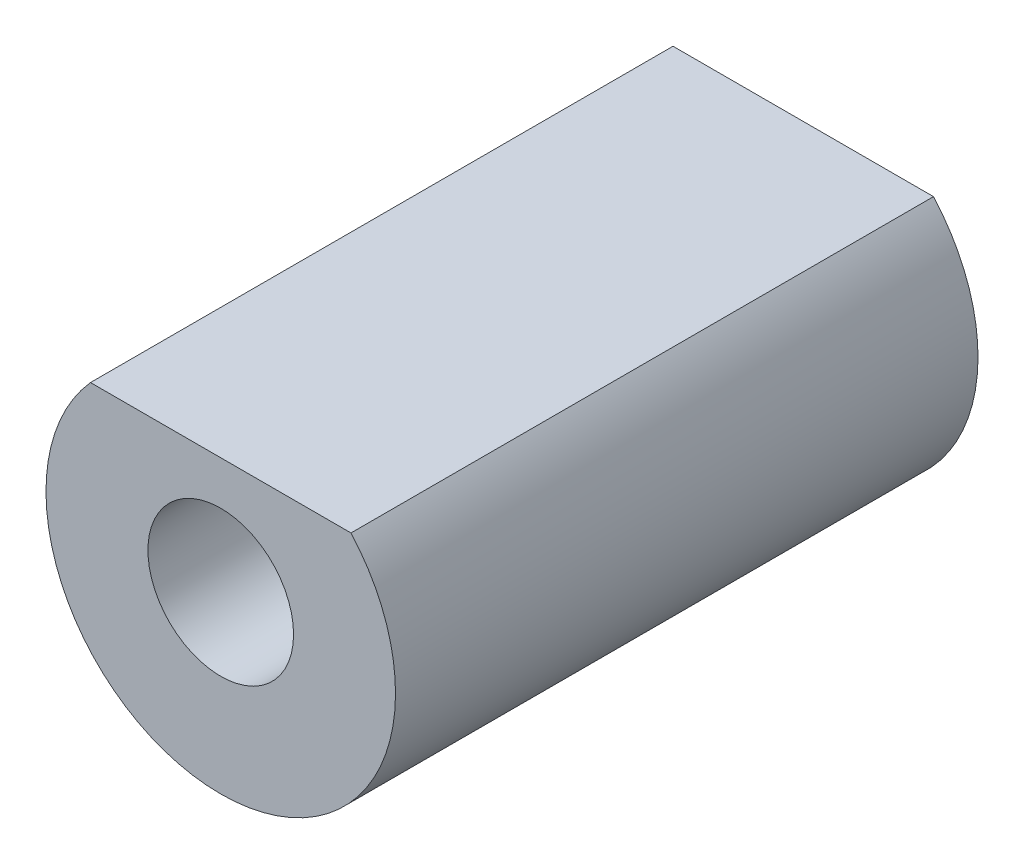
ISO-10303-21;
HEADER;
FILE_DESCRIPTION(('STEP AP214'),'2;1');
FILE_NAME('part.step','',(''),(''),'','','');
FILE_SCHEMA(('AUTOMOTIVE_DESIGN { 1 0 10303 214 1 1 1 1 }'));
ENDSEC;
DATA;
#1=APPLICATION_CONTEXT('core data for automotive mechanical design processes');
#2=APPLICATION_PROTOCOL_DEFINITION('international standard','automotive_design',2000,#1);
#3=PRODUCT_CONTEXT('',#1,'mechanical');
#4=PRODUCT('Part','Part','',(#3));
#5=PRODUCT_RELATED_PRODUCT_CATEGORY('part','',(#4));
#6=PRODUCT_DEFINITION_FORMATION('','',#4);
#7=PRODUCT_DEFINITION_CONTEXT('part definition',#1,'design');
#8=PRODUCT_DEFINITION('design','',#6,#7);
#9=PRODUCT_DEFINITION_SHAPE('','',#8);
#10=(LENGTH_UNIT() NAMED_UNIT(*) SI_UNIT(.MILLI.,.METRE.));
#11=(NAMED_UNIT(*) PLANE_ANGLE_UNIT() SI_UNIT($,.RADIAN.));
#12=(NAMED_UNIT(*) SI_UNIT($,.STERADIAN.) SOLID_ANGLE_UNIT());
#13=UNCERTAINTY_MEASURE_WITH_UNIT(LENGTH_MEASURE(1.E-05),#10,'distance_accuracy_value','');
#14=(GEOMETRIC_REPRESENTATION_CONTEXT(3) GLOBAL_UNCERTAINTY_ASSIGNED_CONTEXT((#13)) GLOBAL_UNIT_ASSIGNED_CONTEXT((#10,
#11,#12)) REPRESENTATION_CONTEXT('',''));
#15=CARTESIAN_POINT('',(0.,0.,0.));
#16=DIRECTION('',(0.,0.,1.));
#17=DIRECTION('',(1.,0.,0.));
#18=AXIS2_PLACEMENT_3D('',#15,#16,#17);
#19=CARTESIAN_POINT('',(0.,0.,10.));
#20=DIRECTION('',(0.,0.,1.));
#21=DIRECTION('',(1.,0.,0.));
#22=AXIS2_PLACEMENT_3D('',#19,#20,#21);
#23=PLANE('',#22);
#24=CARTESIAN_POINT('',(0.,0.,10.));
#25=DIRECTION('',(0.,0.,1.));
#26=DIRECTION('',(1.,0.,0.));
#27=AXIS2_PLACEMENT_3D('',#24,#25,#26);
#28=CIRCLE('',#27,3.);
#29=CARTESIAN_POINT('',(-2.23606797749979,2.,10.));
#30=VERTEX_POINT('',#29);
#31=CARTESIAN_POINT('',(2.23606797749979,2.,10.));
#32=VERTEX_POINT('',#31);
#33=EDGE_CURVE('E72',#30,#32,#28,.T.);
#34=ORIENTED_EDGE('',*,*,#33,.T.);
#35=DIRECTION('',(-1.,0.,0.));
#36=VECTOR('',#35,1.);
#37=CARTESIAN_POINT('',(-2.23606797749979,2.,10.));
#38=LINE('',#37,#36);
#39=EDGE_CURVE('E56',#32,#30,#38,.T.);
#40=ORIENTED_EDGE('',*,*,#39,.T.);
#41=EDGE_LOOP('',(#34,#40));
#42=FACE_BOUND('',#41,.T.);
#43=CARTESIAN_POINT('',(0.,0.,10.));
#44=DIRECTION('',(0.,0.,1.));
#45=DIRECTION('',(1.,0.,0.));
#46=AXIS2_PLACEMENT_3D('',#43,#44,#45);
#47=CIRCLE('',#46,1.25);
#48=CARTESIAN_POINT('',(1.25,0.,10.));
#49=VERTEX_POINT('',#48);
#50=EDGE_CURVE('E80',#49,#49,#47,.T.);
#51=ORIENTED_EDGE('',*,*,#50,.F.);
#52=EDGE_LOOP('',(#51));
#53=FACE_BOUND('',#52,.T.);
#54=ADVANCED_FACE('F39',(#42,#53),#23,.T.);
#55=CARTESIAN_POINT('',(0.,0.,0.));
#56=DIRECTION('',(0.,0.,1.));
#57=DIRECTION('',(1.,0.,0.));
#58=AXIS2_PLACEMENT_3D('',#55,#56,#57);
#59=PLANE('',#58);
#60=CARTESIAN_POINT('',(0.,0.,0.));
#61=DIRECTION('',(0.,0.,1.));
#62=DIRECTION('',(1.,0.,0.));
#63=AXIS2_PLACEMENT_3D('',#60,#61,#62);
#64=CIRCLE('',#63,3.);
#65=CARTESIAN_POINT('',(-2.23606797749979,2.,0.));
#66=VERTEX_POINT('',#65);
#67=CARTESIAN_POINT('',(2.23606797749979,2.,0.));
#68=VERTEX_POINT('',#67);
#69=EDGE_CURVE('E73',#66,#68,#64,.T.);
#70=ORIENTED_EDGE('',*,*,#69,.F.);
#71=DIRECTION('',(-1.,0.,0.));
#72=VECTOR('',#71,1.);
#73=CARTESIAN_POINT('',(-2.23606797749979,2.,0.));
#74=LINE('',#73,#72);
#75=EDGE_CURVE('E64',#68,#66,#74,.T.);
#76=ORIENTED_EDGE('',*,*,#75,.F.);
#77=EDGE_LOOP('',(#70,#76));
#78=FACE_BOUND('',#77,.T.);
#79=CARTESIAN_POINT('',(0.,0.,0.));
#80=DIRECTION('',(0.,0.,1.));
#81=DIRECTION('',(1.,0.,0.));
#82=AXIS2_PLACEMENT_3D('',#79,#80,#81);
#83=CIRCLE('',#82,1.25);
#84=CARTESIAN_POINT('',(1.25,0.,0.));
#85=VERTEX_POINT('',#84);
#86=EDGE_CURVE('E84',#85,#85,#83,.T.);
#87=ORIENTED_EDGE('',*,*,#86,.T.);
#88=EDGE_LOOP('',(#87));
#89=FACE_BOUND('',#88,.T.);
#90=ADVANCED_FACE('F77',(#78,#89),#59,.F.);
#91=CARTESIAN_POINT('',(0.,0.,10.));
#92=DIRECTION('',(0.,0.,-1.));
#93=DIRECTION('',(-1.,0.,0.));
#94=AXIS2_PLACEMENT_3D('',#91,#92,#93);
#95=CYLINDRICAL_SURFACE('',#94,3.);
#96=ORIENTED_EDGE('',*,*,#69,.T.);
#97=DIRECTION('',(0.,0.,-1.));
#98=VECTOR('',#97,1.);
#99=CARTESIAN_POINT('',(2.23606797749979,2.,10.));
#100=LINE('',#99,#98);
#101=EDGE_CURVE('E11',#32,#68,#100,.T.);
#102=ORIENTED_EDGE('',*,*,#101,.F.);
#103=ORIENTED_EDGE('',*,*,#33,.F.);
#104=DIRECTION('',(0.,0.,-1.));
#105=VECTOR('',#104,1.);
#106=CARTESIAN_POINT('',(-2.23606797749979,2.,10.));
#107=LINE('',#106,#105);
#108=EDGE_CURVE('E49',#30,#66,#107,.T.);
#109=ORIENTED_EDGE('',*,*,#108,.T.);
#110=EDGE_LOOP('',(#96,#102,#103,#109));
#111=FACE_BOUND('',#110,.T.);
#112=ADVANCED_FACE('F41',(#111),#95,.T.);
#113=CARTESIAN_POINT('',(-2.23606797749979,2.,10.));
#114=DIRECTION('',(0.,-1.,0.));
#115=DIRECTION('',(0.,0.,-1.));
#116=AXIS2_PLACEMENT_3D('',#113,#114,#115);
#117=PLANE('',#116);
#118=ORIENTED_EDGE('',*,*,#75,.T.);
#119=ORIENTED_EDGE('',*,*,#108,.F.);
#120=ORIENTED_EDGE('',*,*,#39,.F.);
#121=ORIENTED_EDGE('',*,*,#101,.T.);
#122=EDGE_LOOP('',(#118,#119,#120,#121));
#123=FACE_BOUND('',#122,.T.);
#124=ADVANCED_FACE('F67',(#123),#117,.F.);
#125=CARTESIAN_POINT('',(0.,0.,10.));
#126=DIRECTION('',(0.,0.,-1.));
#127=DIRECTION('',(-1.,0.,0.));
#128=AXIS2_PLACEMENT_3D('',#125,#126,#127);
#129=CYLINDRICAL_SURFACE('',#128,1.25);
#130=ORIENTED_EDGE('',*,*,#50,.T.);
#131=EDGE_LOOP('',(#130));
#132=FACE_BOUND('',#131,.T.);
#133=ORIENTED_EDGE('',*,*,#86,.F.);
#134=EDGE_LOOP('',(#133));
#135=FACE_BOUND('',#134,.T.);
#136=ADVANCED_FACE('F95',(#132,#135),#129,.F.);
#137=CLOSED_SHELL('',(#54,#90,#112,#124,#136));
#138=MANIFOLD_SOLID_BREP('B2',#137);
#139=ADVANCED_BREP_SHAPE_REPRESENTATION('',(#18,#138),#14);
#140=SHAPE_DEFINITION_REPRESENTATION(#9,#139);
ENDSEC;
END-ISO-10303-21;
